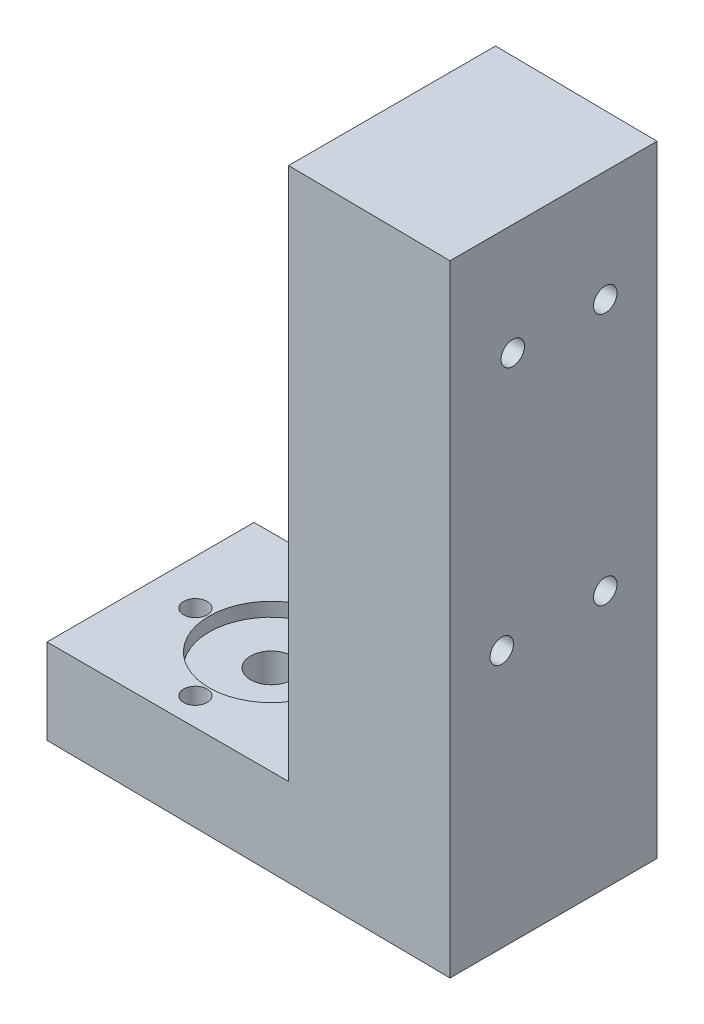
ISO-10303-21;
HEADER;
FILE_DESCRIPTION(('STEP AP214'),'2;1');
FILE_NAME('part.step','',(''),(''),'','','');
FILE_SCHEMA(('AUTOMOTIVE_DESIGN { 1 0 10303 214 1 1 1 1 }'));
ENDSEC;
DATA;
#1=APPLICATION_CONTEXT('core data for automotive mechanical design processes');
#2=APPLICATION_PROTOCOL_DEFINITION('international standard','automotive_design',2000,#1);
#3=PRODUCT_CONTEXT('',#1,'mechanical');
#4=PRODUCT('Part','Part','',(#3));
#5=PRODUCT_RELATED_PRODUCT_CATEGORY('part','',(#4));
#6=PRODUCT_DEFINITION_FORMATION('','',#4);
#7=PRODUCT_DEFINITION_CONTEXT('part definition',#1,'design');
#8=PRODUCT_DEFINITION('design','',#6,#7);
#9=PRODUCT_DEFINITION_SHAPE('','',#8);
#10=(LENGTH_UNIT() NAMED_UNIT(*) SI_UNIT(.MILLI.,.METRE.));
#11=(NAMED_UNIT(*) PLANE_ANGLE_UNIT() SI_UNIT($,.RADIAN.));
#12=(NAMED_UNIT(*) SI_UNIT($,.STERADIAN.) SOLID_ANGLE_UNIT());
#13=UNCERTAINTY_MEASURE_WITH_UNIT(LENGTH_MEASURE(1.E-05),#10,'distance_accuracy_value','');
#14=(GEOMETRIC_REPRESENTATION_CONTEXT(3) GLOBAL_UNCERTAINTY_ASSIGNED_CONTEXT((#13)) GLOBAL_UNIT_ASSIGNED_CONTEXT((#10,
#11,#12)) REPRESENTATION_CONTEXT('',''));
#15=CARTESIAN_POINT('',(0.,0.,0.));
#16=DIRECTION('',(0.,0.,1.));
#17=DIRECTION('',(1.,0.,0.));
#18=AXIS2_PLACEMENT_3D('',#15,#16,#17);
#19=CARTESIAN_POINT('',(17.5,-0.630459459459463,15.));
#20=DIRECTION('',(0.,1.,0.));
#21=DIRECTION('',(-1.,0.,0.));
#22=AXIS2_PLACEMENT_3D('',#19,#20,#21);
#23=CYLINDRICAL_SURFACE('',#22,3.);
#24=CARTESIAN_POINT('',(17.5,-0.188624570452482,15.));
#25=DIRECTION('',(0.0107779208275349,0.999941916524473,0.));
#26=DIRECTION('',(-0.999941916524473,0.0107779208275349,0.));
#27=AXIS2_PLACEMENT_3D('',#24,#25,#26);
#28=ELLIPSE('',#27,3.00017426054824,3.);
#29=CARTESIAN_POINT('',(14.5,-0.156288929803485,15.));
#30=VERTEX_POINT('',#29);
#31=EDGE_CURVE('E356',#30,#30,#28,.F.);
#32=ORIENTED_EDGE('',*,*,#31,.T.);
#33=EDGE_LOOP('',(#32));
#34=FACE_BOUND('',#33,.T.);
#35=CARTESIAN_POINT('',(17.5,10.3345575528868,15.));
#36=DIRECTION('',(0.,1.,0.));
#37=DIRECTION('',(-1.,0.,0.));
#38=AXIS2_PLACEMENT_3D('',#35,#36,#37);
#39=CIRCLE('',#38,3.);
#40=CARTESIAN_POINT('',(14.5,10.3345575528868,15.));
#41=VERTEX_POINT('',#40);
#42=EDGE_CURVE('E51',#41,#41,#39,.F.);
#43=ORIENTED_EDGE('',*,*,#42,.F.);
#44=EDGE_LOOP('',(#43));
#45=FACE_BOUND('',#44,.T.);
#46=ADVANCED_FACE('F50',(#34,#45),#23,.F.);
#47=CARTESIAN_POINT('',(0.,12.3345575528868,30.));
#48=DIRECTION('',(1.,0.,0.));
#49=DIRECTION('',(0.,1.,0.));
#50=AXIS2_PLACEMENT_3D('',#47,#48,#49);
#51=PLANE('',#50);
#52=DIRECTION('',(0.,-1.,0.));
#53=VECTOR('',#52,1.);
#54=CARTESIAN_POINT('',(0.,12.3345575528868,0.));
#55=LINE('',#54,#53);
#56=CARTESIAN_POINT('',(0.,12.3345575528868,0.));
#57=VERTEX_POINT('',#56);
#58=CARTESIAN_POINT('',(0.,0.,0.));
#59=VERTEX_POINT('',#58);
#60=EDGE_CURVE('E136',#57,#59,#55,.T.);
#61=ORIENTED_EDGE('',*,*,#60,.T.);
#62=DIRECTION('',(0.,0.,-1.));
#63=VECTOR('',#62,1.);
#64=CARTESIAN_POINT('',(0.,0.,30.));
#65=LINE('',#64,#63);
#66=CARTESIAN_POINT('',(0.,0.,30.));
#67=VERTEX_POINT('',#66);
#68=EDGE_CURVE('E11',#67,#59,#65,.T.);
#69=ORIENTED_EDGE('',*,*,#68,.F.);
#70=DIRECTION('',(0.,-1.,0.));
#71=VECTOR('',#70,1.);
#72=CARTESIAN_POINT('',(0.,12.3345575528868,30.));
#73=LINE('',#72,#71);
#74=CARTESIAN_POINT('',(0.,12.3345575528868,30.));
#75=VERTEX_POINT('',#74);
#76=EDGE_CURVE('E154',#75,#67,#73,.T.);
#77=ORIENTED_EDGE('',*,*,#76,.F.);
#78=DIRECTION('',(0.,0.,-1.));
#79=VECTOR('',#78,1.);
#80=CARTESIAN_POINT('',(0.,12.3345575528868,30.));
#81=LINE('',#80,#79);
#82=EDGE_CURVE('E132',#75,#57,#81,.T.);
#83=ORIENTED_EDGE('',*,*,#82,.T.);
#84=EDGE_LOOP('',(#61,#69,#77,#83));
#85=FACE_BOUND('',#84,.T.);
#86=ADVANCED_FACE('F47',(#85),#51,.F.);
#87=CARTESIAN_POINT('',(0.,0.,30.));
#88=DIRECTION('',(0.0107779208275349,0.999941916524473,0.));
#89=DIRECTION('',(-0.999941916524473,0.0107779208275349,0.));
#90=AXIS2_PLACEMENT_3D('',#87,#88,#89);
#91=PLANE('',#90);
#92=CARTESIAN_POINT('',(28.5,-0.307188586165471,15.));
#93=DIRECTION('',(0.0107779208275349,0.999941916524473,0.));
#94=DIRECTION('',(-0.999941916524473,0.0107779208275349,0.));
#95=AXIS2_PLACEMENT_3D('',#92,#93,#94);
#96=ELLIPSE('',#95,1.700098747644,1.7);
#97=CARTESIAN_POINT('',(26.8,-0.288865056464373,15.));
#98=VERTEX_POINT('',#97);
#99=EDGE_CURVE('E141',#98,#98,#96,.F.);
#100=ORIENTED_EDGE('',*,*,#99,.F.);
#101=EDGE_LOOP('',(#100));
#102=FACE_BOUND('',#101,.T.);
#103=CARTESIAN_POINT('',(17.5,-0.188624570452482,26.));
#104=DIRECTION('',(0.0107779208275349,0.999941916524473,0.));
#105=DIRECTION('',(-0.999941916524473,0.0107779208275349,0.));
#106=AXIS2_PLACEMENT_3D('',#103,#104,#105);
#107=ELLIPSE('',#106,1.700098747644,1.7);
#108=CARTESIAN_POINT('',(15.8,-0.170301040751384,26.));
#109=VERTEX_POINT('',#108);
#110=EDGE_CURVE('E361',#109,#109,#107,.F.);
#111=ORIENTED_EDGE('',*,*,#110,.F.);
#112=EDGE_LOOP('',(#111));
#113=FACE_BOUND('',#112,.T.);
#114=ORIENTED_EDGE('',*,*,#31,.F.);
#115=EDGE_LOOP('',(#114));
#116=FACE_BOUND('',#115,.T.);
#117=CARTESIAN_POINT('',(6.5,-0.0700605547394935,15.));
#118=DIRECTION('',(0.0107779208275349,0.999941916524473,0.));
#119=DIRECTION('',(-0.999941916524473,0.0107779208275349,0.));
#120=AXIS2_PLACEMENT_3D('',#117,#118,#119);
#121=ELLIPSE('',#120,1.700098747644,1.7);
#122=CARTESIAN_POINT('',(4.8,-0.0517370250383953,15.));
#123=VERTEX_POINT('',#122);
#124=EDGE_CURVE('E363',#123,#123,#121,.F.);
#125=ORIENTED_EDGE('',*,*,#124,.F.);
#126=EDGE_LOOP('',(#125));
#127=FACE_BOUND('',#126,.T.);
#128=CARTESIAN_POINT('',(17.5,-0.188624570452482,4.00000000000001));
#129=DIRECTION('',(0.0107779208275349,0.999941916524473,0.));
#130=DIRECTION('',(-0.999941916524473,0.0107779208275349,0.));
#131=AXIS2_PLACEMENT_3D('',#128,#129,#130);
#132=ELLIPSE('',#131,1.700098747644,1.7);
#133=CARTESIAN_POINT('',(15.8,-0.170301040751384,4.00000000000001));
#134=VERTEX_POINT('',#133);
#135=EDGE_CURVE('E369',#134,#134,#132,.F.);
#136=ORIENTED_EDGE('',*,*,#135,.F.);
#137=EDGE_LOOP('',(#136));
#138=FACE_BOUND('',#137,.T.);
#139=DIRECTION('',(0.999941916524473,-0.0107779208275349,0.));
#140=VECTOR('',#139,1.);
#141=CARTESIAN_POINT('',(0.,0.,0.));
#142=LINE('',#141,#140);
#143=CARTESIAN_POINT('',(58.399287611979,-0.629459459459457,0.));
#144=VERTEX_POINT('',#143);
#145=EDGE_CURVE('E145',#59,#144,#142,.T.);
#146=ORIENTED_EDGE('',*,*,#145,.T.);
#147=DIRECTION('',(0.,0.,-1.));
#148=VECTOR('',#147,1.);
#149=CARTESIAN_POINT('',(58.399287611979,-0.629459459459457,30.));
#150=LINE('',#149,#148);
#151=CARTESIAN_POINT('',(58.399287611979,-0.629459459459457,30.));
#152=VERTEX_POINT('',#151);
#153=EDGE_CURVE('E59',#152,#144,#150,.T.);
#154=ORIENTED_EDGE('',*,*,#153,.F.);
#155=DIRECTION('',(0.999941916524473,-0.0107779208275349,0.));
#156=VECTOR('',#155,1.);
#157=CARTESIAN_POINT('',(0.,0.,30.));
#158=LINE('',#157,#156);
#159=EDGE_CURVE('E101',#67,#152,#158,.T.);
#160=ORIENTED_EDGE('',*,*,#159,.F.);
#161=ORIENTED_EDGE('',*,*,#68,.T.);
#162=EDGE_LOOP('',(#146,#154,#160,#161));
#163=FACE_BOUND('',#162,.T.);
#164=ADVANCED_FACE('F193',(#102,#113,#116,#127,#138,#163),#91,.F.);
#165=CARTESIAN_POINT('',(58.399287611979,-0.629459459459457,30.));
#166=DIRECTION('',(-1.,0.,0.));
#167=DIRECTION('',(0.,0.,1.));
#168=AXIS2_PLACEMENT_3D('',#165,#166,#167);
#169=PLANE('',#168);
#170=CARTESIAN_POINT('',(58.399287611979,73.2705405405405,20.9052971529582));
#171=DIRECTION('',(-1.,0.,0.));
#172=DIRECTION('',(0.,0.,1.));
#173=AXIS2_PLACEMENT_3D('',#170,#171,#172);
#174=CIRCLE('',#173,1.7);
#175=CARTESIAN_POINT('',(58.399287611979,73.2705405405405,22.6052971529582));
#176=VERTEX_POINT('',#175);
#177=EDGE_CURVE('E325',#176,#176,#174,.F.);
#178=ORIENTED_EDGE('',*,*,#177,.F.);
#179=EDGE_LOOP('',(#178));
#180=FACE_BOUND('',#179,.T.);
#181=CARTESIAN_POINT('',(58.399287611979,73.2705405405405,7.5));
#182=DIRECTION('',(-1.,0.,0.));
#183=DIRECTION('',(0.,0.,1.));
#184=AXIS2_PLACEMENT_3D('',#181,#182,#183);
#185=CIRCLE('',#184,1.7);
#186=CARTESIAN_POINT('',(58.399287611979,73.2705405405405,9.2));
#187=VERTEX_POINT('',#186);
#188=EDGE_CURVE('E330',#187,#187,#185,.F.);
#189=ORIENTED_EDGE('',*,*,#188,.F.);
#190=EDGE_LOOP('',(#189));
#191=FACE_BOUND('',#190,.T.);
#192=CARTESIAN_POINT('',(58.399287611979,36.7005405405405,7.5));
#193=DIRECTION('',(-1.,0.,0.));
#194=DIRECTION('',(0.,0.,1.));
#195=AXIS2_PLACEMENT_3D('',#192,#193,#194);
#196=CIRCLE('',#195,1.7);
#197=CARTESIAN_POINT('',(58.399287611979,36.7005405405405,9.2));
#198=VERTEX_POINT('',#197);
#199=EDGE_CURVE('E393',#198,#198,#196,.F.);
#200=ORIENTED_EDGE('',*,*,#199,.F.);
#201=EDGE_LOOP('',(#200));
#202=FACE_BOUND('',#201,.T.);
#203=CARTESIAN_POINT('',(58.399287611979,36.7005405405405,22.5));
#204=DIRECTION('',(-1.,0.,0.));
#205=DIRECTION('',(0.,0.,1.));
#206=AXIS2_PLACEMENT_3D('',#203,#204,#205);
#207=CIRCLE('',#206,1.7);
#208=CARTESIAN_POINT('',(58.399287611979,36.7005405405405,24.2));
#209=VERTEX_POINT('',#208);
#210=EDGE_CURVE('E340',#209,#209,#207,.F.);
#211=ORIENTED_EDGE('',*,*,#210,.F.);
#212=EDGE_LOOP('',(#211));
#213=FACE_BOUND('',#212,.T.);
#214=DIRECTION('',(0.,1.,0.));
#215=VECTOR('',#214,1.);
#216=CARTESIAN_POINT('',(58.399287611979,-0.629459459459457,0.));
#217=LINE('',#216,#215);
#218=CARTESIAN_POINT('',(58.399287611979,89.3705405405405,0.));
#219=VERTEX_POINT('',#218);
#220=EDGE_CURVE('E147',#144,#219,#217,.T.);
#221=ORIENTED_EDGE('',*,*,#220,.T.);
#222=DIRECTION('',(0.,0.,-1.));
#223=VECTOR('',#222,1.);
#224=CARTESIAN_POINT('',(58.399287611979,89.3705405405405,30.));
#225=LINE('',#224,#223);
#226=CARTESIAN_POINT('',(58.399287611979,89.3705405405405,30.));
#227=VERTEX_POINT('',#226);
#228=EDGE_CURVE('E130',#227,#219,#225,.T.);
#229=ORIENTED_EDGE('',*,*,#228,.F.);
#230=DIRECTION('',(0.,1.,0.));
#231=VECTOR('',#230,1.);
#232=CARTESIAN_POINT('',(58.399287611979,-0.629459459459457,30.));
#233=LINE('',#232,#231);
#234=EDGE_CURVE('E116',#152,#227,#233,.T.);
#235=ORIENTED_EDGE('',*,*,#234,.F.);
#236=ORIENTED_EDGE('',*,*,#153,.T.);
#237=EDGE_LOOP('',(#221,#229,#235,#236));
#238=FACE_BOUND('',#237,.T.);
#239=ADVANCED_FACE('F168',(#180,#191,#202,#213,#238),#169,.F.);
#240=CARTESIAN_POINT('',(58.399287611979,89.3705405405405,30.));
#241=DIRECTION('',(-0.0107779208275348,-0.999941916524473,0.));
#242=DIRECTION('',(0.999941916524473,-0.0107779208275348,0.));
#243=AXIS2_PLACEMENT_3D('',#240,#241,#242);
#244=PLANE('',#243);
#245=DIRECTION('',(-0.999941916524473,0.0107779208275348,0.));
#246=VECTOR('',#245,1.);
#247=CARTESIAN_POINT('',(58.399287611979,89.3705405405405,0.));
#248=LINE('',#247,#246);
#249=CARTESIAN_POINT('',(35.,89.622750859095,0.));
#250=VERTEX_POINT('',#249);
#251=EDGE_CURVE('E123',#219,#250,#248,.T.);
#252=ORIENTED_EDGE('',*,*,#251,.T.);
#253=DIRECTION('',(0.,0.,-1.));
#254=VECTOR('',#253,1.);
#255=CARTESIAN_POINT('',(35.,89.622750859095,30.));
#256=LINE('',#255,#254);
#257=CARTESIAN_POINT('',(35.,89.622750859095,30.));
#258=VERTEX_POINT('',#257);
#259=EDGE_CURVE('E125',#258,#250,#256,.T.);
#260=ORIENTED_EDGE('',*,*,#259,.F.);
#261=DIRECTION('',(-0.999941916524473,0.0107779208275348,0.));
#262=VECTOR('',#261,1.);
#263=CARTESIAN_POINT('',(58.399287611979,89.3705405405405,30.));
#264=LINE('',#263,#262);
#265=EDGE_CURVE('E109',#227,#258,#264,.T.);
#266=ORIENTED_EDGE('',*,*,#265,.F.);
#267=ORIENTED_EDGE('',*,*,#228,.T.);
#268=EDGE_LOOP('',(#252,#260,#266,#267));
#269=FACE_BOUND('',#268,.T.);
#270=ADVANCED_FACE('F124',(#269),#244,.F.);
#271=CARTESIAN_POINT('',(35.,89.622750859095,30.));
#272=DIRECTION('',(1.,0.,0.));
#273=DIRECTION('',(0.,1.,0.));
#274=AXIS2_PLACEMENT_3D('',#271,#272,#273);
#275=PLANE('',#274);
#276=CARTESIAN_POINT('',(35.,73.2705405405405,20.9052971529582));
#277=DIRECTION('',(-1.,0.,0.));
#278=DIRECTION('',(0.,-1.,0.));
#279=AXIS2_PLACEMENT_3D('',#276,#277,#278);
#280=CIRCLE('',#279,1.7);
#281=CARTESIAN_POINT('',(35.,71.5705405405405,20.9052971529582));
#282=VERTEX_POINT('',#281);
#283=EDGE_CURVE('E316',#282,#282,#280,.T.);
#284=ORIENTED_EDGE('',*,*,#283,.F.);
#285=EDGE_LOOP('',(#284));
#286=FACE_BOUND('',#285,.T.);
#287=CARTESIAN_POINT('',(35.,73.2705405405405,7.5));
#288=DIRECTION('',(-1.,0.,0.));
#289=DIRECTION('',(0.,-1.,0.));
#290=AXIS2_PLACEMENT_3D('',#287,#288,#289);
#291=CIRCLE('',#290,1.7);
#292=CARTESIAN_POINT('',(35.,71.5705405405405,7.5));
#293=VERTEX_POINT('',#292);
#294=EDGE_CURVE('E329',#293,#293,#291,.T.);
#295=ORIENTED_EDGE('',*,*,#294,.F.);
#296=EDGE_LOOP('',(#295));
#297=FACE_BOUND('',#296,.T.);
#298=CARTESIAN_POINT('',(35.,36.7005405405405,7.5));
#299=DIRECTION('',(-1.,0.,0.));
#300=DIRECTION('',(0.,-1.,0.));
#301=AXIS2_PLACEMENT_3D('',#298,#299,#300);
#302=CIRCLE('',#301,1.7);
#303=CARTESIAN_POINT('',(35.,35.0005405405405,7.5));
#304=VERTEX_POINT('',#303);
#305=EDGE_CURVE('E336',#304,#304,#302,.T.);
#306=ORIENTED_EDGE('',*,*,#305,.F.);
#307=EDGE_LOOP('',(#306));
#308=FACE_BOUND('',#307,.T.);
#309=CARTESIAN_POINT('',(35.,36.7005405405405,22.5));
#310=DIRECTION('',(-1.,0.,0.));
#311=DIRECTION('',(0.,-1.,0.));
#312=AXIS2_PLACEMENT_3D('',#309,#310,#311);
#313=CIRCLE('',#312,1.7);
#314=CARTESIAN_POINT('',(35.,35.0005405405405,22.5));
#315=VERTEX_POINT('',#314);
#316=EDGE_CURVE('E331',#315,#315,#313,.T.);
#317=ORIENTED_EDGE('',*,*,#316,.F.);
#318=EDGE_LOOP('',(#317));
#319=FACE_BOUND('',#318,.T.);
#320=DIRECTION('',(0.,-1.,0.));
#321=VECTOR('',#320,1.);
#322=CARTESIAN_POINT('',(35.,89.622750859095,0.));
#323=LINE('',#322,#321);
#324=CARTESIAN_POINT('',(35.,12.3345575528868,0.));
#325=VERTEX_POINT('',#324);
#326=EDGE_CURVE('E87',#250,#325,#323,.T.);
#327=ORIENTED_EDGE('',*,*,#326,.T.);
#328=DIRECTION('',(0.,0.,-1.));
#329=VECTOR('',#328,1.);
#330=CARTESIAN_POINT('',(35.,12.3345575528868,30.));
#331=LINE('',#330,#329);
#332=CARTESIAN_POINT('',(35.,12.3345575528868,30.));
#333=VERTEX_POINT('',#332);
#334=EDGE_CURVE('E129',#333,#325,#331,.T.);
#335=ORIENTED_EDGE('',*,*,#334,.F.);
#336=DIRECTION('',(0.,-1.,0.));
#337=VECTOR('',#336,1.);
#338=CARTESIAN_POINT('',(35.,89.622750859095,30.));
#339=LINE('',#338,#337);
#340=EDGE_CURVE('E112',#258,#333,#339,.T.);
#341=ORIENTED_EDGE('',*,*,#340,.F.);
#342=ORIENTED_EDGE('',*,*,#259,.T.);
#343=EDGE_LOOP('',(#327,#335,#341,#342));
#344=FACE_BOUND('',#343,.T.);
#345=ADVANCED_FACE('F128',(#286,#297,#308,#319,#344),#275,.F.);
#346=CARTESIAN_POINT('',(35.,12.3345575528868,30.));
#347=DIRECTION('',(0.,-1.,0.));
#348=DIRECTION('',(1.,0.,0.));
#349=AXIS2_PLACEMENT_3D('',#346,#347,#348);
#350=PLANE('',#349);
#351=CARTESIAN_POINT('',(17.5,12.3345575528868,15.));
#352=DIRECTION('',(0.,1.,0.));
#353=DIRECTION('',(-1.,0.,0.));
#354=AXIS2_PLACEMENT_3D('',#351,#352,#353);
#355=CIRCLE('',#354,9.);
#356=CARTESIAN_POINT('',(8.5,12.3345575528868,15.));
#357=VERTEX_POINT('',#356);
#358=EDGE_CURVE('E345',#357,#357,#355,.T.);
#359=ORIENTED_EDGE('',*,*,#358,.F.);
#360=EDGE_LOOP('',(#359));
#361=FACE_BOUND('',#360,.T.);
#362=CARTESIAN_POINT('',(28.5,12.3345575528868,15.));
#363=DIRECTION('',(0.,1.,0.));
#364=DIRECTION('',(-1.,0.,0.));
#365=AXIS2_PLACEMENT_3D('',#362,#363,#364);
#366=CIRCLE('',#365,1.7);
#367=CARTESIAN_POINT('',(26.8,12.3345575528868,15.));
#368=VERTEX_POINT('',#367);
#369=EDGE_CURVE('E349',#368,#368,#366,.T.);
#370=ORIENTED_EDGE('',*,*,#369,.F.);
#371=EDGE_LOOP('',(#370));
#372=FACE_BOUND('',#371,.T.);
#373=CARTESIAN_POINT('',(17.5,12.3345575528868,26.));
#374=DIRECTION('',(0.,1.,0.));
#375=DIRECTION('',(-1.,0.,0.));
#376=AXIS2_PLACEMENT_3D('',#373,#374,#375);
#377=CIRCLE('',#376,1.7);
#378=CARTESIAN_POINT('',(15.8,12.3345575528868,26.));
#379=VERTEX_POINT('',#378);
#380=EDGE_CURVE('E365',#379,#379,#377,.T.);
#381=ORIENTED_EDGE('',*,*,#380,.F.);
#382=EDGE_LOOP('',(#381));
#383=FACE_BOUND('',#382,.T.);
#384=CARTESIAN_POINT('',(6.5,12.3345575528868,15.));
#385=DIRECTION('',(0.,1.,0.));
#386=DIRECTION('',(-1.,0.,0.));
#387=AXIS2_PLACEMENT_3D('',#384,#385,#386);
#388=CIRCLE('',#387,1.7);
#389=CARTESIAN_POINT('',(4.8,12.3345575528868,15.));
#390=VERTEX_POINT('',#389);
#391=EDGE_CURVE('E372',#390,#390,#388,.T.);
#392=ORIENTED_EDGE('',*,*,#391,.F.);
#393=EDGE_LOOP('',(#392));
#394=FACE_BOUND('',#393,.T.);
#395=CARTESIAN_POINT('',(17.5,12.3345575528868,4.00000000000001));
#396=DIRECTION('',(0.,1.,0.));
#397=DIRECTION('',(-1.,0.,0.));
#398=AXIS2_PLACEMENT_3D('',#395,#396,#397);
#399=CIRCLE('',#398,1.7);
#400=CARTESIAN_POINT('',(15.8,12.3345575528868,4.00000000000001));
#401=VERTEX_POINT('',#400);
#402=EDGE_CURVE('E354',#401,#401,#399,.T.);
#403=ORIENTED_EDGE('',*,*,#402,.F.);
#404=EDGE_LOOP('',(#403));
#405=FACE_BOUND('',#404,.T.);
#406=DIRECTION('',(-1.,0.,0.));
#407=VECTOR('',#406,1.);
#408=CARTESIAN_POINT('',(35.,12.3345575528868,0.));
#409=LINE('',#408,#407);
#410=EDGE_CURVE('E92',#325,#57,#409,.T.);
#411=ORIENTED_EDGE('',*,*,#410,.T.);
#412=ORIENTED_EDGE('',*,*,#82,.F.);
#413=DIRECTION('',(-1.,0.,0.));
#414=VECTOR('',#413,1.);
#415=CARTESIAN_POINT('',(35.,12.3345575528868,30.));
#416=LINE('',#415,#414);
#417=EDGE_CURVE('E66',#333,#75,#416,.T.);
#418=ORIENTED_EDGE('',*,*,#417,.F.);
#419=ORIENTED_EDGE('',*,*,#334,.T.);
#420=EDGE_LOOP('',(#411,#412,#418,#419));
#421=FACE_BOUND('',#420,.T.);
#422=ADVANCED_FACE('F173',(#361,#372,#383,#394,#405,#421),#350,.F.);
#423=CARTESIAN_POINT('',(0.,0.,30.));
#424=DIRECTION('',(0.,0.,-1.));
#425=DIRECTION('',(-1.,0.,0.));
#426=AXIS2_PLACEMENT_3D('',#423,#424,#425);
#427=PLANE('',#426);
#428=ORIENTED_EDGE('',*,*,#76,.T.);
#429=ORIENTED_EDGE('',*,*,#159,.T.);
#430=ORIENTED_EDGE('',*,*,#234,.T.);
#431=ORIENTED_EDGE('',*,*,#265,.T.);
#432=ORIENTED_EDGE('',*,*,#340,.T.);
#433=ORIENTED_EDGE('',*,*,#417,.T.);
#434=EDGE_LOOP('',(#428,#429,#430,#431,#432,#433));
#435=FACE_BOUND('',#434,.T.);
#436=ADVANCED_FACE('F115',(#435),#427,.F.);
#437=CARTESIAN_POINT('',(0.,0.,0.));
#438=DIRECTION('',(0.,0.,-1.));
#439=DIRECTION('',(-1.,0.,0.));
#440=AXIS2_PLACEMENT_3D('',#437,#438,#439);
#441=PLANE('',#440);
#442=ORIENTED_EDGE('',*,*,#60,.F.);
#443=ORIENTED_EDGE('',*,*,#410,.F.);
#444=ORIENTED_EDGE('',*,*,#326,.F.);
#445=ORIENTED_EDGE('',*,*,#251,.F.);
#446=ORIENTED_EDGE('',*,*,#220,.F.);
#447=ORIENTED_EDGE('',*,*,#145,.F.);
#448=EDGE_LOOP('',(#442,#443,#444,#445,#446,#447));
#449=FACE_BOUND('',#448,.T.);
#450=ADVANCED_FACE('F169',(#449),#441,.T.);
#451=CARTESIAN_POINT('',(17.5,-0.630459459459463,4.00000000000001));
#452=DIRECTION('',(0.,1.,0.));
#453=DIRECTION('',(-1.,0.,0.));
#454=AXIS2_PLACEMENT_3D('',#451,#452,#453);
#455=CYLINDRICAL_SURFACE('',#454,1.7);
#456=ORIENTED_EDGE('',*,*,#402,.T.);
#457=EDGE_LOOP('',(#456));
#458=FACE_BOUND('',#457,.T.);
#459=ORIENTED_EDGE('',*,*,#135,.T.);
#460=EDGE_LOOP('',(#459));
#461=FACE_BOUND('',#460,.T.);
#462=ADVANCED_FACE('F210',(#458,#461),#455,.F.);
#463=CARTESIAN_POINT('',(6.5,-0.630459459459465,15.));
#464=DIRECTION('',(0.,1.,0.));
#465=DIRECTION('',(-1.,0.,0.));
#466=AXIS2_PLACEMENT_3D('',#463,#464,#465);
#467=CYLINDRICAL_SURFACE('',#466,1.7);
#468=ORIENTED_EDGE('',*,*,#391,.T.);
#469=EDGE_LOOP('',(#468));
#470=FACE_BOUND('',#469,.T.);
#471=ORIENTED_EDGE('',*,*,#124,.T.);
#472=EDGE_LOOP('',(#471));
#473=FACE_BOUND('',#472,.T.);
#474=ADVANCED_FACE('F202',(#470,#473),#467,.F.);
#475=CARTESIAN_POINT('',(17.5,-0.630459459459463,26.));
#476=DIRECTION('',(0.,1.,0.));
#477=DIRECTION('',(-1.,0.,0.));
#478=AXIS2_PLACEMENT_3D('',#475,#476,#477);
#479=CYLINDRICAL_SURFACE('',#478,1.7);
#480=ORIENTED_EDGE('',*,*,#380,.T.);
#481=EDGE_LOOP('',(#480));
#482=FACE_BOUND('',#481,.T.);
#483=ORIENTED_EDGE('',*,*,#110,.T.);
#484=EDGE_LOOP('',(#483));
#485=FACE_BOUND('',#484,.T.);
#486=ADVANCED_FACE('F205',(#482,#485),#479,.F.);
#487=CARTESIAN_POINT('',(28.5,-0.630459459459462,15.));
#488=DIRECTION('',(0.,1.,0.));
#489=DIRECTION('',(-1.,0.,0.));
#490=AXIS2_PLACEMENT_3D('',#487,#488,#489);
#491=CYLINDRICAL_SURFACE('',#490,1.7);
#492=ORIENTED_EDGE('',*,*,#369,.T.);
#493=EDGE_LOOP('',(#492));
#494=FACE_BOUND('',#493,.T.);
#495=ORIENTED_EDGE('',*,*,#99,.T.);
#496=EDGE_LOOP('',(#495));
#497=FACE_BOUND('',#496,.T.);
#498=ADVANCED_FACE('F199',(#494,#497),#491,.F.);
#499=CARTESIAN_POINT('',(17.5,10.3345575528868,15.));
#500=DIRECTION('',(0.,1.,0.));
#501=DIRECTION('',(-1.,0.,0.));
#502=AXIS2_PLACEMENT_3D('',#499,#500,#501);
#503=PLANE('',#502);
#504=CARTESIAN_POINT('',(17.5,10.3345575528868,15.));
#505=DIRECTION('',(0.,1.,0.));
#506=DIRECTION('',(-1.,0.,0.));
#507=AXIS2_PLACEMENT_3D('',#504,#505,#506);
#508=CIRCLE('',#507,9.);
#509=CARTESIAN_POINT('',(8.5,10.3345575528868,15.));
#510=VERTEX_POINT('',#509);
#511=EDGE_CURVE('E344',#510,#510,#508,.T.);
#512=ORIENTED_EDGE('',*,*,#511,.T.);
#513=EDGE_LOOP('',(#512));
#514=FACE_BOUND('',#513,.T.);
#515=ORIENTED_EDGE('',*,*,#42,.T.);
#516=EDGE_LOOP('',(#515));
#517=FACE_BOUND('',#516,.T.);
#518=ADVANCED_FACE('F247',(#514,#517),#503,.T.);
#519=CARTESIAN_POINT('',(17.5,10.3345575528868,15.));
#520=DIRECTION('',(0.,1.,0.));
#521=DIRECTION('',(-1.,0.,0.));
#522=AXIS2_PLACEMENT_3D('',#519,#520,#521);
#523=CYLINDRICAL_SURFACE('',#522,9.);
#524=ORIENTED_EDGE('',*,*,#511,.F.);
#525=EDGE_LOOP('',(#524));
#526=FACE_BOUND('',#525,.T.);
#527=ORIENTED_EDGE('',*,*,#358,.T.);
#528=EDGE_LOOP('',(#527));
#529=FACE_BOUND('',#528,.T.);
#530=ADVANCED_FACE('F263',(#526,#529),#523,.F.);
#531=CARTESIAN_POINT('',(58.400287611979,36.7005405405405,22.5));
#532=DIRECTION('',(-1.,0.,0.));
#533=DIRECTION('',(0.,-1.,0.));
#534=AXIS2_PLACEMENT_3D('',#531,#532,#533);
#535=CYLINDRICAL_SURFACE('',#534,1.7);
#536=ORIENTED_EDGE('',*,*,#316,.T.);
#537=EDGE_LOOP('',(#536));
#538=FACE_BOUND('',#537,.T.);
#539=ORIENTED_EDGE('',*,*,#210,.T.);
#540=EDGE_LOOP('',(#539));
#541=FACE_BOUND('',#540,.T.);
#542=ADVANCED_FACE('F271',(#538,#541),#535,.F.);
#543=CARTESIAN_POINT('',(58.400287611979,36.7005405405405,7.5));
#544=DIRECTION('',(-1.,0.,0.));
#545=DIRECTION('',(0.,-1.,0.));
#546=AXIS2_PLACEMENT_3D('',#543,#544,#545);
#547=CYLINDRICAL_SURFACE('',#546,1.7);
#548=ORIENTED_EDGE('',*,*,#305,.T.);
#549=EDGE_LOOP('',(#548));
#550=FACE_BOUND('',#549,.T.);
#551=ORIENTED_EDGE('',*,*,#199,.T.);
#552=EDGE_LOOP('',(#551));
#553=FACE_BOUND('',#552,.T.);
#554=ADVANCED_FACE('F283',(#550,#553),#547,.F.);
#555=CARTESIAN_POINT('',(58.400287611979,73.2705405405405,7.5));
#556=DIRECTION('',(-1.,0.,0.));
#557=DIRECTION('',(0.,-1.,0.));
#558=AXIS2_PLACEMENT_3D('',#555,#556,#557);
#559=CYLINDRICAL_SURFACE('',#558,1.7);
#560=ORIENTED_EDGE('',*,*,#294,.T.);
#561=EDGE_LOOP('',(#560));
#562=FACE_BOUND('',#561,.T.);
#563=ORIENTED_EDGE('',*,*,#188,.T.);
#564=EDGE_LOOP('',(#563));
#565=FACE_BOUND('',#564,.T.);
#566=ADVANCED_FACE('F291',(#562,#565),#559,.F.);
#567=CARTESIAN_POINT('',(58.400287611979,73.2705405405405,20.9052971529582));
#568=DIRECTION('',(-1.,0.,0.));
#569=DIRECTION('',(0.,-1.,0.));
#570=AXIS2_PLACEMENT_3D('',#567,#568,#569);
#571=CYLINDRICAL_SURFACE('',#570,1.7);
#572=ORIENTED_EDGE('',*,*,#283,.T.);
#573=EDGE_LOOP('',(#572));
#574=FACE_BOUND('',#573,.T.);
#575=ORIENTED_EDGE('',*,*,#177,.T.);
#576=EDGE_LOOP('',(#575));
#577=FACE_BOUND('',#576,.T.);
#578=ADVANCED_FACE('F303',(#574,#577),#571,.F.);
#579=CLOSED_SHELL('',(#46,#86,#164,#239,#270,#345,#422,#436,#450,#462,#474,#486,#498,#518,#530,
#542,#554,#566,#578));
#580=MANIFOLD_SOLID_BREP('B2',#579);
#581=ADVANCED_BREP_SHAPE_REPRESENTATION('',(#18,#580),#14);
#582=SHAPE_DEFINITION_REPRESENTATION(#9,#581);
ENDSEC;
END-ISO-10303-21;
